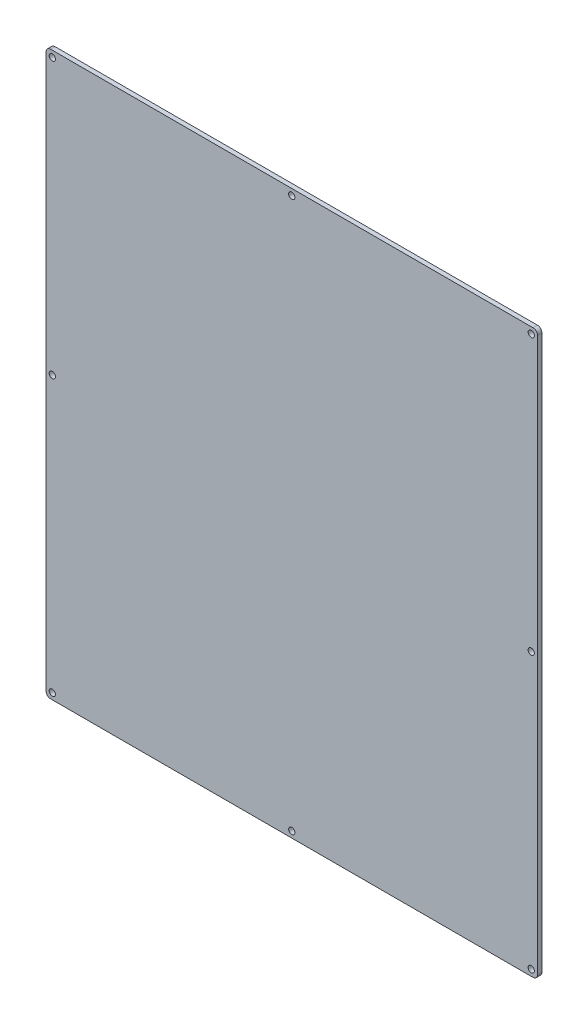
ISO-10303-21;
HEADER;
FILE_DESCRIPTION(('STEP AP214'),'2;1');
FILE_NAME('part.step','',(''),(''),'','','');
FILE_SCHEMA(('AUTOMOTIVE_DESIGN { 1 0 10303 214 1 1 1 1 }'));
ENDSEC;
DATA;
#1=APPLICATION_CONTEXT('core data for automotive mechanical design processes');
#2=APPLICATION_PROTOCOL_DEFINITION('international standard','automotive_design',2000,#1);
#3=PRODUCT_CONTEXT('',#1,'mechanical');
#4=PRODUCT('Part','Part','',(#3));
#5=PRODUCT_RELATED_PRODUCT_CATEGORY('part','',(#4));
#6=PRODUCT_DEFINITION_FORMATION('','',#4);
#7=PRODUCT_DEFINITION_CONTEXT('part definition',#1,'design');
#8=PRODUCT_DEFINITION('design','',#6,#7);
#9=PRODUCT_DEFINITION_SHAPE('','',#8);
#10=(LENGTH_UNIT() NAMED_UNIT(*) SI_UNIT(.MILLI.,.METRE.));
#11=(NAMED_UNIT(*) PLANE_ANGLE_UNIT() SI_UNIT($,.RADIAN.));
#12=(NAMED_UNIT(*) SI_UNIT($,.STERADIAN.) SOLID_ANGLE_UNIT());
#13=UNCERTAINTY_MEASURE_WITH_UNIT(LENGTH_MEASURE(1.E-05),#10,'distance_accuracy_value','');
#14=(GEOMETRIC_REPRESENTATION_CONTEXT(3) GLOBAL_UNCERTAINTY_ASSIGNED_CONTEXT((#13)) GLOBAL_UNIT_ASSIGNED_CONTEXT((#10,
#11,#12)) REPRESENTATION_CONTEXT('',''));
#15=CARTESIAN_POINT('',(0.,0.,0.));
#16=DIRECTION('',(0.,0.,1.));
#17=DIRECTION('',(1.,0.,0.));
#18=AXIS2_PLACEMENT_3D('',#15,#16,#17);
#19=CARTESIAN_POINT('',(0.,0.,2.5));
#20=DIRECTION('',(0.,0.,-1.));
#21=DIRECTION('',(1.,0.,0.));
#22=AXIS2_PLACEMENT_3D('',#19,#20,#21);
#23=PLANE('',#22);
#24=CARTESIAN_POINT('',(-269.,0.,2.5));
#25=DIRECTION('',(0.,0.,-1.));
#26=DIRECTION('',(-1.,0.,0.));
#27=AXIS2_PLACEMENT_3D('',#24,#25,#26);
#28=CIRCLE('',#27,3.5);
#29=CARTESIAN_POINT('',(-272.5,0.,2.5));
#30=VERTEX_POINT('',#29);
#31=EDGE_CURVE('E155',#30,#30,#28,.F.);
#32=ORIENTED_EDGE('',*,*,#31,.F.);
#33=EDGE_LOOP('',(#32));
#34=FACE_BOUND('',#33,.T.);
#35=CARTESIAN_POINT('',(-269.,-309.,2.5));
#36=DIRECTION('',(0.,0.,-1.));
#37=DIRECTION('',(-1.,0.,0.));
#38=AXIS2_PLACEMENT_3D('',#35,#36,#37);
#39=CIRCLE('',#38,3.5);
#40=CARTESIAN_POINT('',(-272.5,-309.,2.5));
#41=VERTEX_POINT('',#40);
#42=EDGE_CURVE('E158',#41,#41,#39,.F.);
#43=ORIENTED_EDGE('',*,*,#42,.F.);
#44=EDGE_LOOP('',(#43));
#45=FACE_BOUND('',#44,.T.);
#46=CARTESIAN_POINT('',(0.,-309.,2.5));
#47=DIRECTION('',(0.,0.,-1.));
#48=DIRECTION('',(-1.,0.,0.));
#49=AXIS2_PLACEMENT_3D('',#46,#47,#48);
#50=CIRCLE('',#49,3.5);
#51=CARTESIAN_POINT('',(-3.49999999999999,-309.,2.5));
#52=VERTEX_POINT('',#51);
#53=EDGE_CURVE('E189',#52,#52,#50,.F.);
#54=ORIENTED_EDGE('',*,*,#53,.F.);
#55=EDGE_LOOP('',(#54));
#56=FACE_BOUND('',#55,.T.);
#57=CARTESIAN_POINT('',(269.,-309.,2.5));
#58=DIRECTION('',(0.,0.,-1.));
#59=DIRECTION('',(-1.,0.,0.));
#60=AXIS2_PLACEMENT_3D('',#57,#58,#59);
#61=CIRCLE('',#60,3.5);
#62=CARTESIAN_POINT('',(265.5,-309.,2.5));
#63=VERTEX_POINT('',#62);
#64=EDGE_CURVE('E183',#63,#63,#61,.F.);
#65=ORIENTED_EDGE('',*,*,#64,.F.);
#66=EDGE_LOOP('',(#65));
#67=FACE_BOUND('',#66,.T.);
#68=CARTESIAN_POINT('',(269.,0.,2.5));
#69=DIRECTION('',(0.,0.,-1.));
#70=DIRECTION('',(-1.,0.,0.));
#71=AXIS2_PLACEMENT_3D('',#68,#69,#70);
#72=CIRCLE('',#71,3.5);
#73=CARTESIAN_POINT('',(265.5,0.,2.5));
#74=VERTEX_POINT('',#73);
#75=EDGE_CURVE('E177',#74,#74,#72,.F.);
#76=ORIENTED_EDGE('',*,*,#75,.F.);
#77=EDGE_LOOP('',(#76));
#78=FACE_BOUND('',#77,.T.);
#79=CARTESIAN_POINT('',(269.,309.,2.5));
#80=DIRECTION('',(0.,0.,-1.));
#81=DIRECTION('',(-1.,0.,0.));
#82=AXIS2_PLACEMENT_3D('',#79,#80,#81);
#83=CIRCLE('',#82,3.5);
#84=CARTESIAN_POINT('',(265.5,309.,2.5));
#85=VERTEX_POINT('',#84);
#86=EDGE_CURVE('E171',#85,#85,#83,.F.);
#87=ORIENTED_EDGE('',*,*,#86,.F.);
#88=EDGE_LOOP('',(#87));
#89=FACE_BOUND('',#88,.T.);
#90=CARTESIAN_POINT('',(0.,309.,2.5));
#91=DIRECTION('',(0.,0.,-1.));
#92=DIRECTION('',(-1.,0.,0.));
#93=AXIS2_PLACEMENT_3D('',#90,#91,#92);
#94=CIRCLE('',#93,3.5);
#95=CARTESIAN_POINT('',(-3.49999999999999,309.,2.5));
#96=VERTEX_POINT('',#95);
#97=EDGE_CURVE('E163',#96,#96,#94,.F.);
#98=ORIENTED_EDGE('',*,*,#97,.F.);
#99=EDGE_LOOP('',(#98));
#100=FACE_BOUND('',#99,.T.);
#101=CARTESIAN_POINT('',(-269.,309.,2.5));
#102=DIRECTION('',(0.,0.,-1.));
#103=DIRECTION('',(-1.,0.,0.));
#104=AXIS2_PLACEMENT_3D('',#101,#102,#103);
#105=CIRCLE('',#104,3.5);
#106=CARTESIAN_POINT('',(-272.5,309.,2.5));
#107=VERTEX_POINT('',#106);
#108=EDGE_CURVE('E160',#107,#107,#105,.F.);
#109=ORIENTED_EDGE('',*,*,#108,.F.);
#110=EDGE_LOOP('',(#109));
#111=FACE_BOUND('',#110,.T.);
#112=DIRECTION('',(1.,0.,0.));
#113=VECTOR('',#112,1.);
#114=CARTESIAN_POINT('',(-276.,316.,2.5));
#115=LINE('',#114,#113);
#116=CARTESIAN_POINT('',(-271.,316.,2.5));
#117=VERTEX_POINT('',#116);
#118=CARTESIAN_POINT('',(271.,316.,2.5));
#119=VERTEX_POINT('',#118);
#120=EDGE_CURVE('E266',#117,#119,#115,.T.);
#121=ORIENTED_EDGE('',*,*,#120,.F.);
#122=CARTESIAN_POINT('',(-271.,311.,2.5));
#123=DIRECTION('',(0.,0.,-1.));
#124=DIRECTION('',(-1.,0.,0.));
#125=AXIS2_PLACEMENT_3D('',#122,#123,#124);
#126=CIRCLE('',#125,5.);
#127=CARTESIAN_POINT('',(-276.,311.,2.5));
#128=VERTEX_POINT('',#127);
#129=EDGE_CURVE('E262',#117,#128,#126,.F.);
#130=ORIENTED_EDGE('',*,*,#129,.T.);
#131=DIRECTION('',(0.,1.,0.));
#132=VECTOR('',#131,1.);
#133=CARTESIAN_POINT('',(-276.,316.,2.5));
#134=LINE('',#133,#132);
#135=CARTESIAN_POINT('',(-276.,-311.,2.5));
#136=VERTEX_POINT('',#135);
#137=EDGE_CURVE('E242',#136,#128,#134,.T.);
#138=ORIENTED_EDGE('',*,*,#137,.F.);
#139=CARTESIAN_POINT('',(-271.,-311.,2.5));
#140=DIRECTION('',(0.,0.,-1.));
#141=DIRECTION('',(-1.,0.,0.));
#142=AXIS2_PLACEMENT_3D('',#139,#140,#141);
#143=CIRCLE('',#142,5.);
#144=CARTESIAN_POINT('',(-271.,-316.,2.5));
#145=VERTEX_POINT('',#144);
#146=EDGE_CURVE('E246',#136,#145,#143,.F.);
#147=ORIENTED_EDGE('',*,*,#146,.T.);
#148=DIRECTION('',(1.,0.,0.));
#149=VECTOR('',#148,1.);
#150=CARTESIAN_POINT('',(-276.,-316.,2.5));
#151=LINE('',#150,#149);
#152=CARTESIAN_POINT('',(271.,-316.,2.5));
#153=VERTEX_POINT('',#152);
#154=EDGE_CURVE('E148',#153,#145,#151,.F.);
#155=ORIENTED_EDGE('',*,*,#154,.F.);
#156=CARTESIAN_POINT('',(271.,-311.,2.5));
#157=DIRECTION('',(0.,0.,-1.));
#158=DIRECTION('',(-1.,0.,0.));
#159=AXIS2_PLACEMENT_3D('',#156,#157,#158);
#160=CIRCLE('',#159,5.);
#161=CARTESIAN_POINT('',(276.,-311.,2.5));
#162=VERTEX_POINT('',#161);
#163=EDGE_CURVE('E130',#153,#162,#160,.F.);
#164=ORIENTED_EDGE('',*,*,#163,.T.);
#165=DIRECTION('',(0.,-1.,0.));
#166=VECTOR('',#165,1.);
#167=CARTESIAN_POINT('',(276.,316.,2.5));
#168=LINE('',#167,#166);
#169=CARTESIAN_POINT('',(276.,311.,2.5));
#170=VERTEX_POINT('',#169);
#171=EDGE_CURVE('E136',#170,#162,#168,.T.);
#172=ORIENTED_EDGE('',*,*,#171,.F.);
#173=CARTESIAN_POINT('',(271.,311.,2.5));
#174=DIRECTION('',(0.,0.,-1.));
#175=DIRECTION('',(-1.,0.,0.));
#176=AXIS2_PLACEMENT_3D('',#173,#174,#175);
#177=CIRCLE('',#176,5.);
#178=EDGE_CURVE('E135',#170,#119,#177,.F.);
#179=ORIENTED_EDGE('',*,*,#178,.T.);
#180=EDGE_LOOP('',(#121,#130,#138,#147,#155,#164,#172,#179));
#181=FACE_BOUND('',#180,.T.);
#182=ADVANCED_FACE('F44',(#34,#45,#56,#67,#78,#89,#100,#111,#181),#23,.F.);
#183=CARTESIAN_POINT('',(-276.,-316.,-2.5));
#184=DIRECTION('',(0.,1.,0.));
#185=DIRECTION('',(0.,0.,-1.));
#186=AXIS2_PLACEMENT_3D('',#183,#184,#185);
#187=PLANE('',#186);
#188=DIRECTION('',(1.,0.,0.));
#189=VECTOR('',#188,1.);
#190=CARTESIAN_POINT('',(0.,-316.,-2.5));
#191=LINE('',#190,#189);
#192=CARTESIAN_POINT('',(-271.,-316.,-2.5));
#193=VERTEX_POINT('',#192);
#194=CARTESIAN_POINT('',(271.,-316.,-2.5));
#195=VERTEX_POINT('',#194);
#196=EDGE_CURVE('E157',#193,#195,#191,.T.);
#197=ORIENTED_EDGE('',*,*,#196,.T.);
#198=DIRECTION('',(0.,0.,1.));
#199=VECTOR('',#198,1.);
#200=CARTESIAN_POINT('',(271.,-316.,-2.5));
#201=LINE('',#200,#199);
#202=EDGE_CURVE('E118',#195,#153,#201,.T.);
#203=ORIENTED_EDGE('',*,*,#202,.T.);
#204=ORIENTED_EDGE('',*,*,#154,.T.);
#205=DIRECTION('',(0.,0.,1.));
#206=VECTOR('',#205,1.);
#207=CARTESIAN_POINT('',(-271.,-316.,-2.5));
#208=LINE('',#207,#206);
#209=EDGE_CURVE('E261',#145,#193,#208,.F.);
#210=ORIENTED_EDGE('',*,*,#209,.T.);
#211=EDGE_LOOP('',(#197,#203,#204,#210));
#212=FACE_BOUND('',#211,.T.);
#213=ADVANCED_FACE('F204',(#212),#187,.F.);
#214=CARTESIAN_POINT('',(271.,-311.,-2.5));
#215=DIRECTION('',(0.,0.,1.));
#216=DIRECTION('',(-1.,0.,0.));
#217=AXIS2_PLACEMENT_3D('',#214,#215,#216);
#218=CYLINDRICAL_SURFACE('',#217,5.);
#219=CARTESIAN_POINT('',(271.,-311.,-2.5));
#220=DIRECTION('',(0.,0.,-1.));
#221=DIRECTION('',(-1.,0.,0.));
#222=AXIS2_PLACEMENT_3D('',#219,#220,#221);
#223=CIRCLE('',#222,5.);
#224=CARTESIAN_POINT('',(276.,-311.,-2.5));
#225=VERTEX_POINT('',#224);
#226=EDGE_CURVE('E132',#195,#225,#223,.F.);
#227=ORIENTED_EDGE('',*,*,#226,.T.);
#228=DIRECTION('',(0.,0.,-1.));
#229=VECTOR('',#228,1.);
#230=CARTESIAN_POINT('',(276.,-311.,-2.5));
#231=LINE('',#230,#229);
#232=EDGE_CURVE('E126',#162,#225,#231,.T.);
#233=ORIENTED_EDGE('',*,*,#232,.F.);
#234=ORIENTED_EDGE('',*,*,#163,.F.);
#235=ORIENTED_EDGE('',*,*,#202,.F.);
#236=EDGE_LOOP('',(#227,#233,#234,#235));
#237=FACE_BOUND('',#236,.T.);
#238=ADVANCED_FACE('F128',(#237),#218,.T.);
#239=CARTESIAN_POINT('',(276.,316.,-2.5));
#240=DIRECTION('',(-1.,0.,0.));
#241=DIRECTION('',(0.,-1.,0.));
#242=AXIS2_PLACEMENT_3D('',#239,#240,#241);
#243=PLANE('',#242);
#244=DIRECTION('',(0.,1.,0.));
#245=VECTOR('',#244,1.);
#246=CARTESIAN_POINT('',(276.,0.,-2.5));
#247=LINE('',#246,#245);
#248=CARTESIAN_POINT('',(276.,311.,-2.5));
#249=VERTEX_POINT('',#248);
#250=EDGE_CURVE('E259',#225,#249,#247,.T.);
#251=ORIENTED_EDGE('',*,*,#250,.T.);
#252=DIRECTION('',(0.,0.,1.));
#253=VECTOR('',#252,1.);
#254=CARTESIAN_POINT('',(276.,311.,-2.5));
#255=LINE('',#254,#253);
#256=EDGE_CURVE('E141',#249,#170,#255,.T.);
#257=ORIENTED_EDGE('',*,*,#256,.T.);
#258=ORIENTED_EDGE('',*,*,#171,.T.);
#259=ORIENTED_EDGE('',*,*,#232,.T.);
#260=EDGE_LOOP('',(#251,#257,#258,#259));
#261=FACE_BOUND('',#260,.T.);
#262=ADVANCED_FACE('F139',(#261),#243,.F.);
#263=CARTESIAN_POINT('',(271.,311.,-2.5));
#264=DIRECTION('',(0.,0.,1.));
#265=DIRECTION('',(-1.,0.,0.));
#266=AXIS2_PLACEMENT_3D('',#263,#264,#265);
#267=CYLINDRICAL_SURFACE('',#266,5.);
#268=CARTESIAN_POINT('',(271.,311.,-2.5));
#269=DIRECTION('',(0.,0.,-1.));
#270=DIRECTION('',(-1.,0.,0.));
#271=AXIS2_PLACEMENT_3D('',#268,#269,#270);
#272=CIRCLE('',#271,5.);
#273=CARTESIAN_POINT('',(271.,316.,-2.5));
#274=VERTEX_POINT('',#273);
#275=EDGE_CURVE('E253',#249,#274,#272,.F.);
#276=ORIENTED_EDGE('',*,*,#275,.T.);
#277=DIRECTION('',(0.,0.,1.));
#278=VECTOR('',#277,1.);
#279=CARTESIAN_POINT('',(271.,316.,-2.5));
#280=LINE('',#279,#278);
#281=EDGE_CURVE('E263',#119,#274,#280,.F.);
#282=ORIENTED_EDGE('',*,*,#281,.F.);
#283=ORIENTED_EDGE('',*,*,#178,.F.);
#284=ORIENTED_EDGE('',*,*,#256,.F.);
#285=EDGE_LOOP('',(#276,#282,#283,#284));
#286=FACE_BOUND('',#285,.T.);
#287=ADVANCED_FACE('F275',(#286),#267,.T.);
#288=CARTESIAN_POINT('',(-276.,316.,-2.5));
#289=DIRECTION('',(0.,-1.,0.));
#290=DIRECTION('',(0.,0.,1.));
#291=AXIS2_PLACEMENT_3D('',#288,#289,#290);
#292=PLANE('',#291);
#293=DIRECTION('',(1.,0.,0.));
#294=VECTOR('',#293,1.);
#295=CARTESIAN_POINT('',(0.,316.,-2.5));
#296=LINE('',#295,#294);
#297=CARTESIAN_POINT('',(-271.,316.,-2.5));
#298=VERTEX_POINT('',#297);
#299=EDGE_CURVE('E251',#274,#298,#296,.F.);
#300=ORIENTED_EDGE('',*,*,#299,.T.);
#301=DIRECTION('',(0.,0.,1.));
#302=VECTOR('',#301,1.);
#303=CARTESIAN_POINT('',(-271.,316.,-2.5));
#304=LINE('',#303,#302);
#305=EDGE_CURVE('E249',#298,#117,#304,.T.);
#306=ORIENTED_EDGE('',*,*,#305,.T.);
#307=ORIENTED_EDGE('',*,*,#120,.T.);
#308=ORIENTED_EDGE('',*,*,#281,.T.);
#309=EDGE_LOOP('',(#300,#306,#307,#308));
#310=FACE_BOUND('',#309,.T.);
#311=ADVANCED_FACE('F274',(#310),#292,.F.);
#312=CARTESIAN_POINT('',(-271.,311.,-2.5));
#313=DIRECTION('',(0.,0.,1.));
#314=DIRECTION('',(-1.,0.,0.));
#315=AXIS2_PLACEMENT_3D('',#312,#313,#314);
#316=CYLINDRICAL_SURFACE('',#315,5.);
#317=CARTESIAN_POINT('',(-271.,311.,-2.5));
#318=DIRECTION('',(0.,0.,-1.));
#319=DIRECTION('',(-1.,0.,0.));
#320=AXIS2_PLACEMENT_3D('',#317,#318,#319);
#321=CIRCLE('',#320,5.);
#322=CARTESIAN_POINT('',(-276.,311.,-2.5));
#323=VERTEX_POINT('',#322);
#324=EDGE_CURVE('E234',#298,#323,#321,.F.);
#325=ORIENTED_EDGE('',*,*,#324,.T.);
#326=DIRECTION('',(0.,0.,-1.));
#327=VECTOR('',#326,1.);
#328=CARTESIAN_POINT('',(-276.,311.,-2.5));
#329=LINE('',#328,#327);
#330=EDGE_CURVE('E239',#128,#323,#329,.T.);
#331=ORIENTED_EDGE('',*,*,#330,.F.);
#332=ORIENTED_EDGE('',*,*,#129,.F.);
#333=ORIENTED_EDGE('',*,*,#305,.F.);
#334=EDGE_LOOP('',(#325,#331,#332,#333));
#335=FACE_BOUND('',#334,.T.);
#336=ADVANCED_FACE('F248',(#335),#316,.T.);
#337=CARTESIAN_POINT('',(-276.,316.,-2.5));
#338=DIRECTION('',(1.,0.,0.));
#339=DIRECTION('',(0.,1.,0.));
#340=AXIS2_PLACEMENT_3D('',#337,#338,#339);
#341=PLANE('',#340);
#342=ORIENTED_EDGE('',*,*,#137,.T.);
#343=ORIENTED_EDGE('',*,*,#330,.T.);
#344=DIRECTION('',(0.,1.,0.));
#345=VECTOR('',#344,1.);
#346=CARTESIAN_POINT('',(-276.,0.,-2.5));
#347=LINE('',#346,#345);
#348=CARTESIAN_POINT('',(-276.,-311.,-2.5));
#349=VERTEX_POINT('',#348);
#350=EDGE_CURVE('E231',#323,#349,#347,.F.);
#351=ORIENTED_EDGE('',*,*,#350,.T.);
#352=DIRECTION('',(0.,0.,1.));
#353=VECTOR('',#352,1.);
#354=CARTESIAN_POINT('',(-276.,-311.,-2.5));
#355=LINE('',#354,#353);
#356=EDGE_CURVE('E164',#349,#136,#355,.T.);
#357=ORIENTED_EDGE('',*,*,#356,.T.);
#358=EDGE_LOOP('',(#342,#343,#351,#357));
#359=FACE_BOUND('',#358,.T.);
#360=ADVANCED_FACE('F240',(#359),#341,.F.);
#361=CARTESIAN_POINT('',(-271.,-311.,-2.5));
#362=DIRECTION('',(0.,0.,1.));
#363=DIRECTION('',(-1.,0.,0.));
#364=AXIS2_PLACEMENT_3D('',#361,#362,#363);
#365=CYLINDRICAL_SURFACE('',#364,5.);
#366=CARTESIAN_POINT('',(-271.,-311.,-2.5));
#367=DIRECTION('',(0.,0.,-1.));
#368=DIRECTION('',(-1.,0.,0.));
#369=AXIS2_PLACEMENT_3D('',#366,#367,#368);
#370=CIRCLE('',#369,5.);
#371=EDGE_CURVE('E62',#349,#193,#370,.F.);
#372=ORIENTED_EDGE('',*,*,#371,.T.);
#373=ORIENTED_EDGE('',*,*,#209,.F.);
#374=ORIENTED_EDGE('',*,*,#146,.F.);
#375=ORIENTED_EDGE('',*,*,#356,.F.);
#376=EDGE_LOOP('',(#372,#373,#374,#375));
#377=FACE_BOUND('',#376,.T.);
#378=ADVANCED_FACE('F222',(#377),#365,.T.);
#379=CARTESIAN_POINT('',(-269.,309.,2.5));
#380=DIRECTION('',(0.,0.,-1.));
#381=DIRECTION('',(1.,0.,0.));
#382=AXIS2_PLACEMENT_3D('',#379,#380,#381);
#383=CYLINDRICAL_SURFACE('',#382,3.5);
#384=ORIENTED_EDGE('',*,*,#108,.T.);
#385=EDGE_LOOP('',(#384));
#386=FACE_BOUND('',#385,.T.);
#387=CARTESIAN_POINT('',(-269.,309.,-2.5));
#388=DIRECTION('',(0.,0.,-1.));
#389=DIRECTION('',(-1.,0.,0.));
#390=AXIS2_PLACEMENT_3D('',#387,#388,#389);
#391=CIRCLE('',#390,3.5);
#392=CARTESIAN_POINT('',(-272.5,309.,-2.5));
#393=VERTEX_POINT('',#392);
#394=EDGE_CURVE('E165',#393,#393,#391,.T.);
#395=ORIENTED_EDGE('',*,*,#394,.T.);
#396=EDGE_LOOP('',(#395));
#397=FACE_BOUND('',#396,.T.);
#398=ADVANCED_FACE('F46',(#386,#397),#383,.F.);
#399=CARTESIAN_POINT('',(0.,309.,2.5));
#400=DIRECTION('',(0.,0.,-1.));
#401=DIRECTION('',(1.,0.,0.));
#402=AXIS2_PLACEMENT_3D('',#399,#400,#401);
#403=CYLINDRICAL_SURFACE('',#402,3.5);
#404=ORIENTED_EDGE('',*,*,#97,.T.);
#405=EDGE_LOOP('',(#404));
#406=FACE_BOUND('',#405,.T.);
#407=CARTESIAN_POINT('',(0.,309.,-2.5));
#408=DIRECTION('',(0.,0.,-1.));
#409=DIRECTION('',(-1.,0.,0.));
#410=AXIS2_PLACEMENT_3D('',#407,#408,#409);
#411=CIRCLE('',#410,3.5);
#412=CARTESIAN_POINT('',(-3.49999999999999,309.,-2.5));
#413=VERTEX_POINT('',#412);
#414=EDGE_CURVE('E168',#413,#413,#411,.T.);
#415=ORIENTED_EDGE('',*,*,#414,.T.);
#416=EDGE_LOOP('',(#415));
#417=FACE_BOUND('',#416,.T.);
#418=ADVANCED_FACE('F221',(#406,#417),#403,.F.);
#419=CARTESIAN_POINT('',(269.,309.,2.5));
#420=DIRECTION('',(0.,0.,-1.));
#421=DIRECTION('',(1.,0.,0.));
#422=AXIS2_PLACEMENT_3D('',#419,#420,#421);
#423=CYLINDRICAL_SURFACE('',#422,3.5);
#424=ORIENTED_EDGE('',*,*,#86,.T.);
#425=EDGE_LOOP('',(#424));
#426=FACE_BOUND('',#425,.T.);
#427=CARTESIAN_POINT('',(269.,309.,-2.5));
#428=DIRECTION('',(0.,0.,-1.));
#429=DIRECTION('',(-1.,0.,0.));
#430=AXIS2_PLACEMENT_3D('',#427,#428,#429);
#431=CIRCLE('',#430,3.5);
#432=CARTESIAN_POINT('',(265.5,309.,-2.5));
#433=VERTEX_POINT('',#432);
#434=EDGE_CURVE('E174',#433,#433,#431,.T.);
#435=ORIENTED_EDGE('',*,*,#434,.T.);
#436=EDGE_LOOP('',(#435));
#437=FACE_BOUND('',#436,.T.);
#438=ADVANCED_FACE('F307',(#426,#437),#423,.F.);
#439=CARTESIAN_POINT('',(269.,0.,2.5));
#440=DIRECTION('',(0.,0.,-1.));
#441=DIRECTION('',(1.,0.,0.));
#442=AXIS2_PLACEMENT_3D('',#439,#440,#441);
#443=CYLINDRICAL_SURFACE('',#442,3.5);
#444=ORIENTED_EDGE('',*,*,#75,.T.);
#445=EDGE_LOOP('',(#444));
#446=FACE_BOUND('',#445,.T.);
#447=CARTESIAN_POINT('',(269.,0.,-2.5));
#448=DIRECTION('',(0.,0.,-1.));
#449=DIRECTION('',(-1.,0.,0.));
#450=AXIS2_PLACEMENT_3D('',#447,#448,#449);
#451=CIRCLE('',#450,3.5);
#452=CARTESIAN_POINT('',(265.5,0.,-2.5));
#453=VERTEX_POINT('',#452);
#454=EDGE_CURVE('E180',#453,#453,#451,.T.);
#455=ORIENTED_EDGE('',*,*,#454,.T.);
#456=EDGE_LOOP('',(#455));
#457=FACE_BOUND('',#456,.T.);
#458=ADVANCED_FACE('F303',(#446,#457),#443,.F.);
#459=CARTESIAN_POINT('',(269.,-309.,2.5));
#460=DIRECTION('',(0.,0.,-1.));
#461=DIRECTION('',(1.,0.,0.));
#462=AXIS2_PLACEMENT_3D('',#459,#460,#461);
#463=CYLINDRICAL_SURFACE('',#462,3.5);
#464=ORIENTED_EDGE('',*,*,#64,.T.);
#465=EDGE_LOOP('',(#464));
#466=FACE_BOUND('',#465,.T.);
#467=CARTESIAN_POINT('',(269.,-309.,-2.5));
#468=DIRECTION('',(0.,0.,-1.));
#469=DIRECTION('',(-1.,0.,0.));
#470=AXIS2_PLACEMENT_3D('',#467,#468,#469);
#471=CIRCLE('',#470,3.5);
#472=CARTESIAN_POINT('',(265.5,-309.,-2.5));
#473=VERTEX_POINT('',#472);
#474=EDGE_CURVE('E186',#473,#473,#471,.T.);
#475=ORIENTED_EDGE('',*,*,#474,.T.);
#476=EDGE_LOOP('',(#475));
#477=FACE_BOUND('',#476,.T.);
#478=ADVANCED_FACE('F299',(#466,#477),#463,.F.);
#479=CARTESIAN_POINT('',(0.,-309.,2.5));
#480=DIRECTION('',(0.,0.,-1.));
#481=DIRECTION('',(1.,0.,0.));
#482=AXIS2_PLACEMENT_3D('',#479,#480,#481);
#483=CYLINDRICAL_SURFACE('',#482,3.5);
#484=ORIENTED_EDGE('',*,*,#53,.T.);
#485=EDGE_LOOP('',(#484));
#486=FACE_BOUND('',#485,.T.);
#487=CARTESIAN_POINT('',(0.,-309.,-2.5));
#488=DIRECTION('',(0.,0.,-1.));
#489=DIRECTION('',(-1.,0.,0.));
#490=AXIS2_PLACEMENT_3D('',#487,#488,#489);
#491=CIRCLE('',#490,3.5);
#492=CARTESIAN_POINT('',(-3.49999999999999,-309.,-2.5));
#493=VERTEX_POINT('',#492);
#494=EDGE_CURVE('E192',#493,#493,#491,.T.);
#495=ORIENTED_EDGE('',*,*,#494,.T.);
#496=EDGE_LOOP('',(#495));
#497=FACE_BOUND('',#496,.T.);
#498=ADVANCED_FACE('F296',(#486,#497),#483,.F.);
#499=CARTESIAN_POINT('',(-269.,-309.,2.5));
#500=DIRECTION('',(0.,0.,-1.));
#501=DIRECTION('',(1.,0.,0.));
#502=AXIS2_PLACEMENT_3D('',#499,#500,#501);
#503=CYLINDRICAL_SURFACE('',#502,3.5);
#504=ORIENTED_EDGE('',*,*,#42,.T.);
#505=EDGE_LOOP('',(#504));
#506=FACE_BOUND('',#505,.T.);
#507=CARTESIAN_POINT('',(-269.,-309.,-2.5));
#508=DIRECTION('',(0.,0.,-1.));
#509=DIRECTION('',(-1.,0.,0.));
#510=AXIS2_PLACEMENT_3D('',#507,#508,#509);
#511=CIRCLE('',#510,3.5);
#512=CARTESIAN_POINT('',(-272.5,-309.,-2.5));
#513=VERTEX_POINT('',#512);
#514=EDGE_CURVE('E48',#513,#513,#511,.T.);
#515=ORIENTED_EDGE('',*,*,#514,.T.);
#516=EDGE_LOOP('',(#515));
#517=FACE_BOUND('',#516,.T.);
#518=ADVANCED_FACE('F199',(#506,#517),#503,.F.);
#519=CARTESIAN_POINT('',(-269.,0.,2.5));
#520=DIRECTION('',(0.,0.,-1.));
#521=DIRECTION('',(1.,0.,0.));
#522=AXIS2_PLACEMENT_3D('',#519,#520,#521);
#523=CYLINDRICAL_SURFACE('',#522,3.5);
#524=ORIENTED_EDGE('',*,*,#31,.T.);
#525=EDGE_LOOP('',(#524));
#526=FACE_BOUND('',#525,.T.);
#527=CARTESIAN_POINT('',(-269.,0.,-2.5));
#528=DIRECTION('',(0.,0.,-1.));
#529=DIRECTION('',(-1.,0.,0.));
#530=AXIS2_PLACEMENT_3D('',#527,#528,#529);
#531=CIRCLE('',#530,3.5);
#532=CARTESIAN_POINT('',(-272.5,0.,-2.5));
#533=VERTEX_POINT('',#532);
#534=EDGE_CURVE('E11',#533,#533,#531,.T.);
#535=ORIENTED_EDGE('',*,*,#534,.T.);
#536=EDGE_LOOP('',(#535));
#537=FACE_BOUND('',#536,.T.);
#538=ADVANCED_FACE('F227',(#526,#537),#523,.F.);
#539=CARTESIAN_POINT('',(0.,0.,-2.5));
#540=DIRECTION('',(0.,0.,-1.));
#541=DIRECTION('',(1.,0.,0.));
#542=AXIS2_PLACEMENT_3D('',#539,#540,#541);
#543=PLANE('',#542);
#544=ORIENTED_EDGE('',*,*,#534,.F.);
#545=EDGE_LOOP('',(#544));
#546=FACE_BOUND('',#545,.T.);
#547=ORIENTED_EDGE('',*,*,#514,.F.);
#548=EDGE_LOOP('',(#547));
#549=FACE_BOUND('',#548,.T.);
#550=ORIENTED_EDGE('',*,*,#494,.F.);
#551=EDGE_LOOP('',(#550));
#552=FACE_BOUND('',#551,.T.);
#553=ORIENTED_EDGE('',*,*,#474,.F.);
#554=EDGE_LOOP('',(#553));
#555=FACE_BOUND('',#554,.T.);
#556=ORIENTED_EDGE('',*,*,#454,.F.);
#557=EDGE_LOOP('',(#556));
#558=FACE_BOUND('',#557,.T.);
#559=ORIENTED_EDGE('',*,*,#434,.F.);
#560=EDGE_LOOP('',(#559));
#561=FACE_BOUND('',#560,.T.);
#562=ORIENTED_EDGE('',*,*,#414,.F.);
#563=EDGE_LOOP('',(#562));
#564=FACE_BOUND('',#563,.T.);
#565=ORIENTED_EDGE('',*,*,#394,.F.);
#566=EDGE_LOOP('',(#565));
#567=FACE_BOUND('',#566,.T.);
#568=ORIENTED_EDGE('',*,*,#350,.F.);
#569=ORIENTED_EDGE('',*,*,#324,.F.);
#570=ORIENTED_EDGE('',*,*,#299,.F.);
#571=ORIENTED_EDGE('',*,*,#275,.F.);
#572=ORIENTED_EDGE('',*,*,#250,.F.);
#573=ORIENTED_EDGE('',*,*,#226,.F.);
#574=ORIENTED_EDGE('',*,*,#196,.F.);
#575=ORIENTED_EDGE('',*,*,#371,.F.);
#576=EDGE_LOOP('',(#568,#569,#570,#571,#572,#573,#574,#575));
#577=FACE_BOUND('',#576,.T.);
#578=ADVANCED_FACE('F225',(#546,#549,#552,#555,#558,#561,#564,#567,#577),#543,.T.);
#579=CLOSED_SHELL('',(#182,#213,#238,#262,#287,#311,#336,#360,#378,#398,#418,#438,#458,#478,
#498,#518,#538,#578));
#580=MANIFOLD_SOLID_BREP('B2',#579);
#581=ADVANCED_BREP_SHAPE_REPRESENTATION('',(#18,#580),#14);
#582=SHAPE_DEFINITION_REPRESENTATION(#9,#581);
ENDSEC;
END-ISO-10303-21;
